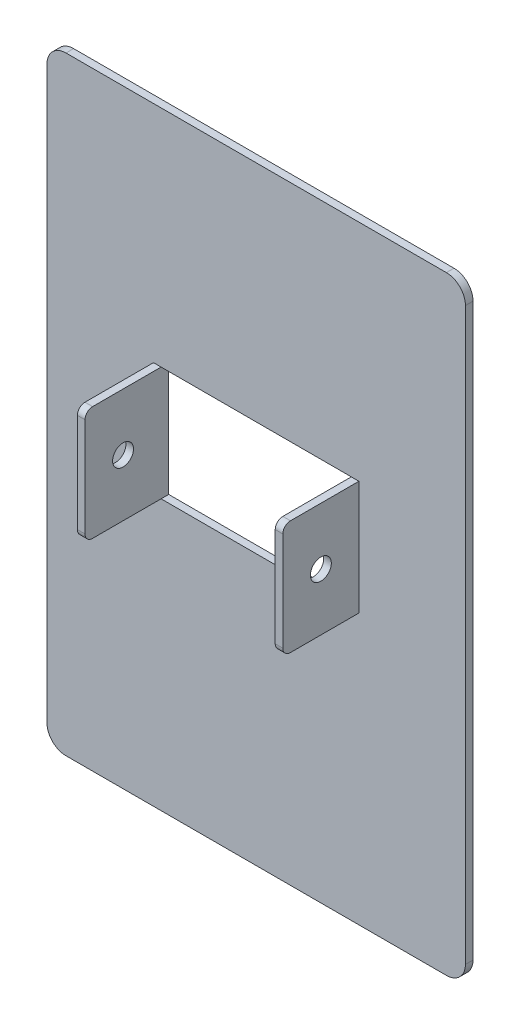
ISO-10303-21;
HEADER;
FILE_DESCRIPTION(('STEP AP214'),'2;1');
FILE_NAME('part.step','',(''),(''),'','','');
FILE_SCHEMA(('AUTOMOTIVE_DESIGN { 1 0 10303 214 1 1 1 1 }'));
ENDSEC;
DATA;
#1=APPLICATION_CONTEXT('core data for automotive mechanical design processes');
#2=APPLICATION_PROTOCOL_DEFINITION('international standard','automotive_design',2000,#1);
#3=PRODUCT_CONTEXT('',#1,'mechanical');
#4=PRODUCT('Part','Part','',(#3));
#5=PRODUCT_RELATED_PRODUCT_CATEGORY('part','',(#4));
#6=PRODUCT_DEFINITION_FORMATION('','',#4);
#7=PRODUCT_DEFINITION_CONTEXT('part definition',#1,'design');
#8=PRODUCT_DEFINITION('design','',#6,#7);
#9=PRODUCT_DEFINITION_SHAPE('','',#8);
#10=(LENGTH_UNIT() NAMED_UNIT(*) SI_UNIT(.MILLI.,.METRE.));
#11=(NAMED_UNIT(*) PLANE_ANGLE_UNIT() SI_UNIT($,.RADIAN.));
#12=(NAMED_UNIT(*) SI_UNIT($,.STERADIAN.) SOLID_ANGLE_UNIT());
#13=UNCERTAINTY_MEASURE_WITH_UNIT(LENGTH_MEASURE(1.E-05),#10,'distance_accuracy_value','');
#14=(GEOMETRIC_REPRESENTATION_CONTEXT(3) GLOBAL_UNCERTAINTY_ASSIGNED_CONTEXT((#13)) GLOBAL_UNIT_ASSIGNED_CONTEXT((#10,
#11,#12)) REPRESENTATION_CONTEXT('',''));
#15=CARTESIAN_POINT('',(0.,0.,0.));
#16=DIRECTION('',(0.,0.,1.));
#17=DIRECTION('',(1.,0.,0.));
#18=AXIS2_PLACEMENT_3D('',#15,#16,#17);
#19=CARTESIAN_POINT('',(27.,90.,22.));
#20=DIRECTION('',(-1.,0.,0.));
#21=DIRECTION('',(0.,0.,1.));
#22=AXIS2_PLACEMENT_3D('',#19,#20,#21);
#23=PLANE('',#22);
#24=CARTESIAN_POINT('',(27.,118.,20.));
#25=DIRECTION('',(-1.,0.,0.));
#26=DIRECTION('',(0.,0.,1.));
#27=AXIS2_PLACEMENT_3D('',#24,#25,#26);
#28=CIRCLE('',#27,2.);
#29=CARTESIAN_POINT('',(27.,118.,22.));
#30=VERTEX_POINT('',#29);
#31=CARTESIAN_POINT('',(27.,120.,20.));
#32=VERTEX_POINT('',#31);
#33=EDGE_CURVE('E170',#30,#32,#28,.T.);
#34=ORIENTED_EDGE('',*,*,#33,.F.);
#35=DIRECTION('',(0.,1.,0.));
#36=VECTOR('',#35,1.);
#37=CARTESIAN_POINT('',(27.,90.,22.));
#38=LINE('',#37,#36);
#39=CARTESIAN_POINT('',(27.,92.,22.));
#40=VERTEX_POINT('',#39);
#41=EDGE_CURVE('E146',#30,#40,#38,.F.);
#42=ORIENTED_EDGE('',*,*,#41,.T.);
#43=CARTESIAN_POINT('',(27.,92.,20.));
#44=DIRECTION('',(1.,0.,0.));
#45=DIRECTION('',(0.,0.,-1.));
#46=AXIS2_PLACEMENT_3D('',#43,#44,#45);
#47=CIRCLE('',#46,2.);
#48=CARTESIAN_POINT('',(27.,90.,20.));
#49=VERTEX_POINT('',#48);
#50=EDGE_CURVE('E139',#49,#40,#47,.F.);
#51=ORIENTED_EDGE('',*,*,#50,.F.);
#52=DIRECTION('',(0.,0.,1.));
#53=VECTOR('',#52,1.);
#54=CARTESIAN_POINT('',(27.,90.,22.));
#55=LINE('',#54,#53);
#56=CARTESIAN_POINT('',(27.,90.,2.));
#57=VERTEX_POINT('',#56);
#58=EDGE_CURVE('E143',#49,#57,#55,.F.);
#59=ORIENTED_EDGE('',*,*,#58,.T.);
#60=DIRECTION('',(0.,1.,0.));
#61=VECTOR('',#60,1.);
#62=CARTESIAN_POINT('',(27.,174.,2.));
#63=LINE('',#62,#61);
#64=CARTESIAN_POINT('',(27.,120.,2.));
#65=VERTEX_POINT('',#64);
#66=EDGE_CURVE('E173',#65,#57,#63,.F.);
#67=ORIENTED_EDGE('',*,*,#66,.F.);
#68=DIRECTION('',(0.,0.,-1.));
#69=VECTOR('',#68,1.);
#70=CARTESIAN_POINT('',(27.,120.,22.));
#71=LINE('',#70,#69);
#72=EDGE_CURVE('E158',#65,#32,#71,.F.);
#73=ORIENTED_EDGE('',*,*,#72,.T.);
#74=EDGE_LOOP('',(#34,#42,#51,#59,#67,#73));
#75=FACE_BOUND('',#74,.T.);
#76=CARTESIAN_POINT('',(27.,105.,12.));
#77=DIRECTION('',(-1.,0.,0.));
#78=DIRECTION('',(0.,0.,1.));
#79=AXIS2_PLACEMENT_3D('',#76,#77,#78);
#80=CIRCLE('',#79,2.75);
#81=CARTESIAN_POINT('',(27.,105.,14.75));
#82=VERTEX_POINT('',#81);
#83=EDGE_CURVE('E21',#82,#82,#80,.T.);
#84=ORIENTED_EDGE('',*,*,#83,.T.);
#85=EDGE_LOOP('',(#84));
#86=FACE_BOUND('',#85,.T.);
#87=ADVANCED_FACE('F18',(#75,#86),#23,.F.);
#88=CARTESIAN_POINT('',(-27.,120.,22.));
#89=DIRECTION('',(1.,0.,0.));
#90=DIRECTION('',(0.,0.,-1.));
#91=AXIS2_PLACEMENT_3D('',#88,#89,#90);
#92=PLANE('',#91);
#93=CARTESIAN_POINT('',(-27.,118.,20.));
#94=DIRECTION('',(-1.,0.,0.));
#95=DIRECTION('',(0.,0.,1.));
#96=AXIS2_PLACEMENT_3D('',#93,#94,#95);
#97=CIRCLE('',#96,2.);
#98=CARTESIAN_POINT('',(-27.,120.,20.));
#99=VERTEX_POINT('',#98);
#100=CARTESIAN_POINT('',(-27.,118.,22.));
#101=VERTEX_POINT('',#100);
#102=EDGE_CURVE('E203',#99,#101,#97,.F.);
#103=ORIENTED_EDGE('',*,*,#102,.F.);
#104=DIRECTION('',(0.,0.,-1.));
#105=VECTOR('',#104,1.);
#106=CARTESIAN_POINT('',(-27.,120.,22.));
#107=LINE('',#106,#105);
#108=CARTESIAN_POINT('',(-27.,120.,2.));
#109=VERTEX_POINT('',#108);
#110=EDGE_CURVE('E176',#99,#109,#107,.T.);
#111=ORIENTED_EDGE('',*,*,#110,.T.);
#112=DIRECTION('',(0.,1.,0.));
#113=VECTOR('',#112,1.);
#114=CARTESIAN_POINT('',(-27.,174.,2.));
#115=LINE('',#114,#113);
#116=CARTESIAN_POINT('',(-27.,90.,2.));
#117=VERTEX_POINT('',#116);
#118=EDGE_CURVE('E184',#117,#109,#115,.T.);
#119=ORIENTED_EDGE('',*,*,#118,.F.);
#120=DIRECTION('',(0.,0.,1.));
#121=VECTOR('',#120,1.);
#122=CARTESIAN_POINT('',(-27.,90.,22.));
#123=LINE('',#122,#121);
#124=CARTESIAN_POINT('',(-27.,90.,20.));
#125=VERTEX_POINT('',#124);
#126=EDGE_CURVE('E191',#117,#125,#123,.T.);
#127=ORIENTED_EDGE('',*,*,#126,.T.);
#128=CARTESIAN_POINT('',(-27.,92.,20.));
#129=DIRECTION('',(1.,0.,0.));
#130=DIRECTION('',(0.,0.,-1.));
#131=AXIS2_PLACEMENT_3D('',#128,#129,#130);
#132=CIRCLE('',#131,2.);
#133=CARTESIAN_POINT('',(-27.,92.,22.));
#134=VERTEX_POINT('',#133);
#135=EDGE_CURVE('E194',#134,#125,#132,.T.);
#136=ORIENTED_EDGE('',*,*,#135,.F.);
#137=DIRECTION('',(0.,1.,0.));
#138=VECTOR('',#137,1.);
#139=CARTESIAN_POINT('',(-27.,120.,22.));
#140=LINE('',#139,#138);
#141=EDGE_CURVE('E200',#134,#101,#140,.T.);
#142=ORIENTED_EDGE('',*,*,#141,.T.);
#143=EDGE_LOOP('',(#103,#111,#119,#127,#136,#142));
#144=FACE_BOUND('',#143,.T.);
#145=CARTESIAN_POINT('',(-27.,105.,12.));
#146=DIRECTION('',(-1.,0.,0.));
#147=DIRECTION('',(0.,0.,1.));
#148=AXIS2_PLACEMENT_3D('',#145,#146,#147);
#149=CIRCLE('',#148,2.75);
#150=CARTESIAN_POINT('',(-27.,105.,14.75));
#151=VERTEX_POINT('',#150);
#152=EDGE_CURVE('E195',#151,#151,#149,.F.);
#153=ORIENTED_EDGE('',*,*,#152,.T.);
#154=EDGE_LOOP('',(#153));
#155=FACE_BOUND('',#154,.T.);
#156=ADVANCED_FACE('F683',(#144,#155),#92,.F.);
#157=CARTESIAN_POINT('',(34.778174593052,105.,12.));
#158=DIRECTION('',(-1.,0.,0.));
#159=DIRECTION('',(0.,0.,1.));
#160=AXIS2_PLACEMENT_3D('',#157,#158,#159);
#161=CYLINDRICAL_SURFACE('',#160,2.75);
#162=CARTESIAN_POINT('',(25.,105.,12.));
#163=DIRECTION('',(-1.,0.,0.));
#164=DIRECTION('',(0.,0.,1.));
#165=AXIS2_PLACEMENT_3D('',#162,#163,#164);
#166=CIRCLE('',#165,2.75);
#167=CARTESIAN_POINT('',(25.,105.,14.75));
#168=VERTEX_POINT('',#167);
#169=EDGE_CURVE('E255',#168,#168,#166,.T.);
#170=ORIENTED_EDGE('',*,*,#169,.T.);
#171=EDGE_LOOP('',(#170));
#172=FACE_BOUND('',#171,.T.);
#173=ORIENTED_EDGE('',*,*,#83,.F.);
#174=EDGE_LOOP('',(#173));
#175=FACE_BOUND('',#174,.T.);
#176=ADVANCED_FACE('F675',(#172,#175),#161,.F.);
#177=CARTESIAN_POINT('',(25.,92.,20.));
#178=DIRECTION('',(1.,0.,0.));
#179=DIRECTION('',(0.,0.,-1.));
#180=AXIS2_PLACEMENT_3D('',#177,#178,#179);
#181=CYLINDRICAL_SURFACE('',#180,2.);
#182=ORIENTED_EDGE('',*,*,#50,.T.);
#183=DIRECTION('',(-1.,0.,0.));
#184=VECTOR('',#183,1.);
#185=CARTESIAN_POINT('',(25.,92.,22.));
#186=LINE('',#185,#184);
#187=CARTESIAN_POINT('',(25.,92.,22.));
#188=VERTEX_POINT('',#187);
#189=EDGE_CURVE('E268',#40,#188,#186,.T.);
#190=ORIENTED_EDGE('',*,*,#189,.T.);
#191=CARTESIAN_POINT('',(25.,92.,20.));
#192=DIRECTION('',(1.,0.,0.));
#193=DIRECTION('',(0.,0.,-1.));
#194=AXIS2_PLACEMENT_3D('',#191,#192,#193);
#195=CIRCLE('',#194,2.);
#196=CARTESIAN_POINT('',(25.,90.,20.));
#197=VERTEX_POINT('',#196);
#198=EDGE_CURVE('E162',#188,#197,#195,.T.);
#199=ORIENTED_EDGE('',*,*,#198,.T.);
#200=DIRECTION('',(1.,0.,0.));
#201=VECTOR('',#200,1.);
#202=CARTESIAN_POINT('',(27.,90.,20.));
#203=LINE('',#202,#201);
#204=EDGE_CURVE('E151',#197,#49,#203,.T.);
#205=ORIENTED_EDGE('',*,*,#204,.T.);
#206=EDGE_LOOP('',(#182,#190,#199,#205));
#207=FACE_BOUND('',#206,.T.);
#208=ADVANCED_FACE('F161',(#207),#181,.T.);
#209=CARTESIAN_POINT('',(27.,90.,22.));
#210=DIRECTION('',(0.,1.,0.));
#211=DIRECTION('',(0.,0.,1.));
#212=AXIS2_PLACEMENT_3D('',#209,#210,#211);
#213=PLANE('',#212);
#214=ORIENTED_EDGE('',*,*,#204,.F.);
#215=DIRECTION('',(0.,0.,-1.));
#216=VECTOR('',#215,1.);
#217=CARTESIAN_POINT('',(25.,90.,-58.309518948453));
#218=LINE('',#217,#216);
#219=CARTESIAN_POINT('',(25.,90.,2.));
#220=VERTEX_POINT('',#219);
#221=EDGE_CURVE('E254',#197,#220,#218,.T.);
#222=ORIENTED_EDGE('',*,*,#221,.T.);
#223=DIRECTION('',(1.,0.,0.));
#224=VECTOR('',#223,1.);
#225=CARTESIAN_POINT('',(50.,90.,2.));
#226=LINE('',#225,#224);
#227=EDGE_CURVE('E157',#57,#220,#226,.F.);
#228=ORIENTED_EDGE('',*,*,#227,.F.);
#229=ORIENTED_EDGE('',*,*,#58,.F.);
#230=EDGE_LOOP('',(#214,#222,#228,#229));
#231=FACE_BOUND('',#230,.T.);
#232=ADVANCED_FACE('F153',(#231),#213,.F.);
#233=CARTESIAN_POINT('',(27.,120.,22.));
#234=DIRECTION('',(0.,-1.,0.));
#235=DIRECTION('',(0.,0.,-1.));
#236=AXIS2_PLACEMENT_3D('',#233,#234,#235);
#237=PLANE('',#236);
#238=DIRECTION('',(-1.,0.,0.));
#239=VECTOR('',#238,1.);
#240=CARTESIAN_POINT('',(25.,120.,20.));
#241=LINE('',#240,#239);
#242=CARTESIAN_POINT('',(25.,120.,20.));
#243=VERTEX_POINT('',#242);
#244=EDGE_CURVE('E265',#32,#243,#241,.T.);
#245=ORIENTED_EDGE('',*,*,#244,.F.);
#246=ORIENTED_EDGE('',*,*,#72,.F.);
#247=DIRECTION('',(1.,0.,0.));
#248=VECTOR('',#247,1.);
#249=CARTESIAN_POINT('',(50.,120.,2.));
#250=LINE('',#249,#248);
#251=CARTESIAN_POINT('',(25.,120.,2.));
#252=VERTEX_POINT('',#251);
#253=EDGE_CURVE('E258',#252,#65,#250,.T.);
#254=ORIENTED_EDGE('',*,*,#253,.F.);
#255=DIRECTION('',(0.,0.,-1.));
#256=VECTOR('',#255,1.);
#257=CARTESIAN_POINT('',(25.,120.,-58.309518948453));
#258=LINE('',#257,#256);
#259=EDGE_CURVE('E252',#252,#243,#258,.F.);
#260=ORIENTED_EDGE('',*,*,#259,.T.);
#261=EDGE_LOOP('',(#245,#246,#254,#260));
#262=FACE_BOUND('',#261,.T.);
#263=ADVANCED_FACE('F424',(#262),#237,.F.);
#264=CARTESIAN_POINT('',(25.,118.,20.));
#265=DIRECTION('',(-1.,0.,0.));
#266=DIRECTION('',(0.,0.,1.));
#267=AXIS2_PLACEMENT_3D('',#264,#265,#266);
#268=CYLINDRICAL_SURFACE('',#267,2.);
#269=CARTESIAN_POINT('',(25.,118.,20.));
#270=DIRECTION('',(-1.,0.,0.));
#271=DIRECTION('',(0.,0.,1.));
#272=AXIS2_PLACEMENT_3D('',#269,#270,#271);
#273=CIRCLE('',#272,2.);
#274=CARTESIAN_POINT('',(25.,118.,22.));
#275=VERTEX_POINT('',#274);
#276=EDGE_CURVE('E248',#243,#275,#273,.F.);
#277=ORIENTED_EDGE('',*,*,#276,.T.);
#278=DIRECTION('',(-1.,0.,0.));
#279=VECTOR('',#278,1.);
#280=CARTESIAN_POINT('',(25.,118.,22.));
#281=LINE('',#280,#279);
#282=EDGE_CURVE('E205',#275,#30,#281,.F.);
#283=ORIENTED_EDGE('',*,*,#282,.T.);
#284=ORIENTED_EDGE('',*,*,#33,.T.);
#285=ORIENTED_EDGE('',*,*,#244,.T.);
#286=EDGE_LOOP('',(#277,#283,#284,#285));
#287=FACE_BOUND('',#286,.T.);
#288=ADVANCED_FACE('F344',(#287),#268,.T.);
#289=CARTESIAN_POINT('',(25.,90.,22.));
#290=DIRECTION('',(0.,0.,-1.));
#291=DIRECTION('',(-1.,0.,0.));
#292=AXIS2_PLACEMENT_3D('',#289,#290,#291);
#293=PLANE('',#292);
#294=ORIENTED_EDGE('',*,*,#282,.F.);
#295=DIRECTION('',(0.,1.,0.));
#296=VECTOR('',#295,1.);
#297=CARTESIAN_POINT('',(25.,120.,22.));
#298=LINE('',#297,#296);
#299=EDGE_CURVE('E251',#275,#188,#298,.F.);
#300=ORIENTED_EDGE('',*,*,#299,.T.);
#301=ORIENTED_EDGE('',*,*,#189,.F.);
#302=ORIENTED_EDGE('',*,*,#41,.F.);
#303=EDGE_LOOP('',(#294,#300,#301,#302));
#304=FACE_BOUND('',#303,.T.);
#305=ADVANCED_FACE('F348',(#304),#293,.F.);
#306=CARTESIAN_POINT('',(34.778174593052,105.,12.));
#307=DIRECTION('',(-1.,0.,0.));
#308=DIRECTION('',(0.,0.,1.));
#309=AXIS2_PLACEMENT_3D('',#306,#307,#308);
#310=CYLINDRICAL_SURFACE('',#309,2.75);
#311=CARTESIAN_POINT('',(-25.,105.,12.));
#312=DIRECTION('',(-1.,0.,0.));
#313=DIRECTION('',(0.,0.,1.));
#314=AXIS2_PLACEMENT_3D('',#311,#312,#313);
#315=CIRCLE('',#314,2.75);
#316=CARTESIAN_POINT('',(-25.,105.,14.75));
#317=VERTEX_POINT('',#316);
#318=EDGE_CURVE('E243',#317,#317,#315,.F.);
#319=ORIENTED_EDGE('',*,*,#318,.T.);
#320=EDGE_LOOP('',(#319));
#321=FACE_BOUND('',#320,.T.);
#322=ORIENTED_EDGE('',*,*,#152,.F.);
#323=EDGE_LOOP('',(#322));
#324=FACE_BOUND('',#323,.T.);
#325=ADVANCED_FACE('F631',(#321,#324),#310,.F.);
#326=CARTESIAN_POINT('',(-27.,90.,22.));
#327=DIRECTION('',(0.,1.,0.));
#328=DIRECTION('',(0.,0.,1.));
#329=AXIS2_PLACEMENT_3D('',#326,#327,#328);
#330=PLANE('',#329);
#331=DIRECTION('',(1.,0.,0.));
#332=VECTOR('',#331,1.);
#333=CARTESIAN_POINT('',(-25.,90.,20.));
#334=LINE('',#333,#332);
#335=CARTESIAN_POINT('',(-25.,90.,20.));
#336=VERTEX_POINT('',#335);
#337=EDGE_CURVE('E262',#125,#336,#334,.T.);
#338=ORIENTED_EDGE('',*,*,#337,.F.);
#339=ORIENTED_EDGE('',*,*,#126,.F.);
#340=DIRECTION('',(1.,0.,0.));
#341=VECTOR('',#340,1.);
#342=CARTESIAN_POINT('',(50.,90.,2.));
#343=LINE('',#342,#341);
#344=CARTESIAN_POINT('',(-25.,90.,2.));
#345=VERTEX_POINT('',#344);
#346=EDGE_CURVE('E188',#345,#117,#343,.F.);
#347=ORIENTED_EDGE('',*,*,#346,.F.);
#348=DIRECTION('',(0.,0.,1.));
#349=VECTOR('',#348,1.);
#350=CARTESIAN_POINT('',(-25.,90.,-58.309518948453));
#351=LINE('',#350,#349);
#352=EDGE_CURVE('E242',#345,#336,#351,.T.);
#353=ORIENTED_EDGE('',*,*,#352,.T.);
#354=EDGE_LOOP('',(#338,#339,#347,#353));
#355=FACE_BOUND('',#354,.T.);
#356=ADVANCED_FACE('F391',(#355),#330,.F.);
#357=CARTESIAN_POINT('',(-25.,92.,20.));
#358=DIRECTION('',(1.,0.,0.));
#359=DIRECTION('',(0.,0.,-1.));
#360=AXIS2_PLACEMENT_3D('',#357,#358,#359);
#361=CYLINDRICAL_SURFACE('',#360,2.);
#362=CARTESIAN_POINT('',(-25.,92.,20.));
#363=DIRECTION('',(1.,0.,0.));
#364=DIRECTION('',(0.,0.,-1.));
#365=AXIS2_PLACEMENT_3D('',#362,#363,#364);
#366=CIRCLE('',#365,2.);
#367=CARTESIAN_POINT('',(-25.,92.,22.));
#368=VERTEX_POINT('',#367);
#369=EDGE_CURVE('E239',#336,#368,#366,.F.);
#370=ORIENTED_EDGE('',*,*,#369,.T.);
#371=DIRECTION('',(-1.,0.,0.));
#372=VECTOR('',#371,1.);
#373=CARTESIAN_POINT('',(-25.,92.,22.));
#374=LINE('',#373,#372);
#375=EDGE_CURVE('E204',#368,#134,#374,.T.);
#376=ORIENTED_EDGE('',*,*,#375,.T.);
#377=ORIENTED_EDGE('',*,*,#135,.T.);
#378=ORIENTED_EDGE('',*,*,#337,.T.);
#379=EDGE_LOOP('',(#370,#376,#377,#378));
#380=FACE_BOUND('',#379,.T.);
#381=ADVANCED_FACE('F614',(#380),#361,.T.);
#382=CARTESIAN_POINT('',(-25.,120.,22.));
#383=DIRECTION('',(0.,0.,-1.));
#384=DIRECTION('',(-1.,0.,0.));
#385=AXIS2_PLACEMENT_3D('',#382,#383,#384);
#386=PLANE('',#385);
#387=DIRECTION('',(-1.,0.,0.));
#388=VECTOR('',#387,1.);
#389=CARTESIAN_POINT('',(-25.,118.,22.));
#390=LINE('',#389,#388);
#391=CARTESIAN_POINT('',(-25.,118.,22.));
#392=VERTEX_POINT('',#391);
#393=EDGE_CURVE('E260',#101,#392,#390,.F.);
#394=ORIENTED_EDGE('',*,*,#393,.F.);
#395=ORIENTED_EDGE('',*,*,#141,.F.);
#396=ORIENTED_EDGE('',*,*,#375,.F.);
#397=DIRECTION('',(0.,1.,0.));
#398=VECTOR('',#397,1.);
#399=CARTESIAN_POINT('',(-25.,120.,22.));
#400=LINE('',#399,#398);
#401=EDGE_CURVE('E238',#368,#392,#400,.T.);
#402=ORIENTED_EDGE('',*,*,#401,.T.);
#403=EDGE_LOOP('',(#394,#395,#396,#402));
#404=FACE_BOUND('',#403,.T.);
#405=ADVANCED_FACE('F605',(#404),#386,.F.);
#406=CARTESIAN_POINT('',(-25.,118.,20.));
#407=DIRECTION('',(-1.,0.,0.));
#408=DIRECTION('',(0.,0.,1.));
#409=AXIS2_PLACEMENT_3D('',#406,#407,#408);
#410=CYLINDRICAL_SURFACE('',#409,2.);
#411=ORIENTED_EDGE('',*,*,#102,.T.);
#412=ORIENTED_EDGE('',*,*,#393,.T.);
#413=CARTESIAN_POINT('',(-25.,118.,20.));
#414=DIRECTION('',(-1.,0.,0.));
#415=DIRECTION('',(0.,0.,1.));
#416=AXIS2_PLACEMENT_3D('',#413,#414,#415);
#417=CIRCLE('',#416,2.);
#418=CARTESIAN_POINT('',(-25.,120.,20.));
#419=VERTEX_POINT('',#418);
#420=EDGE_CURVE('E234',#392,#419,#417,.T.);
#421=ORIENTED_EDGE('',*,*,#420,.T.);
#422=DIRECTION('',(1.,0.,0.));
#423=VECTOR('',#422,1.);
#424=CARTESIAN_POINT('',(-27.,120.,20.));
#425=LINE('',#424,#423);
#426=EDGE_CURVE('E181',#419,#99,#425,.F.);
#427=ORIENTED_EDGE('',*,*,#426,.T.);
#428=EDGE_LOOP('',(#411,#412,#421,#427));
#429=FACE_BOUND('',#428,.T.);
#430=ADVANCED_FACE('F596',(#429),#410,.T.);
#431=CARTESIAN_POINT('',(-27.,120.,22.));
#432=DIRECTION('',(0.,-1.,0.));
#433=DIRECTION('',(0.,0.,-1.));
#434=AXIS2_PLACEMENT_3D('',#431,#432,#433);
#435=PLANE('',#434);
#436=ORIENTED_EDGE('',*,*,#426,.F.);
#437=DIRECTION('',(0.,0.,1.));
#438=VECTOR('',#437,1.);
#439=CARTESIAN_POINT('',(-25.,120.,-58.309518948453));
#440=LINE('',#439,#438);
#441=CARTESIAN_POINT('',(-25.,120.,2.));
#442=VERTEX_POINT('',#441);
#443=EDGE_CURVE('E237',#419,#442,#440,.F.);
#444=ORIENTED_EDGE('',*,*,#443,.T.);
#445=DIRECTION('',(1.,0.,0.));
#446=VECTOR('',#445,1.);
#447=CARTESIAN_POINT('',(50.,120.,2.));
#448=LINE('',#447,#446);
#449=EDGE_CURVE('E187',#109,#442,#448,.T.);
#450=ORIENTED_EDGE('',*,*,#449,.F.);
#451=ORIENTED_EDGE('',*,*,#110,.F.);
#452=EDGE_LOOP('',(#436,#444,#450,#451));
#453=FACE_BOUND('',#452,.T.);
#454=ADVANCED_FACE('F588',(#453),#435,.F.);
#455=CARTESIAN_POINT('',(50.,174.,2.));
#456=DIRECTION('',(0.,0.,1.));
#457=DIRECTION('',(1.,0.,0.));
#458=AXIS2_PLACEMENT_3D('',#455,#456,#457);
#459=PLANE('',#458);
#460=DIRECTION('',(1.,0.,0.));
#461=VECTOR('',#460,1.);
#462=CARTESIAN_POINT('',(-25.,120.,2.));
#463=LINE('',#462,#461);
#464=EDGE_CURVE('E280',#442,#252,#463,.T.);
#465=ORIENTED_EDGE('',*,*,#464,.T.);
#466=ORIENTED_EDGE('',*,*,#253,.T.);
#467=ORIENTED_EDGE('',*,*,#66,.T.);
#468=ORIENTED_EDGE('',*,*,#227,.T.);
#469=DIRECTION('',(1.,0.,0.));
#470=VECTOR('',#469,1.);
#471=CARTESIAN_POINT('',(-25.,90.,2.));
#472=LINE('',#471,#470);
#473=EDGE_CURVE('E247',#220,#345,#472,.F.);
#474=ORIENTED_EDGE('',*,*,#473,.T.);
#475=ORIENTED_EDGE('',*,*,#346,.T.);
#476=ORIENTED_EDGE('',*,*,#118,.T.);
#477=ORIENTED_EDGE('',*,*,#449,.T.);
#478=EDGE_LOOP('',(#465,#466,#467,#468,#474,#475,#476,#477));
#479=FACE_BOUND('',#478,.T.);
#480=CARTESIAN_POINT('',(50.,24.,2.));
#481=DIRECTION('',(0.,0.,-1.));
#482=DIRECTION('',(-1.,0.,0.));
#483=AXIS2_PLACEMENT_3D('',#480,#481,#482);
#484=CIRCLE('',#483,5.);
#485=CARTESIAN_POINT('',(55.,24.,2.));
#486=VERTEX_POINT('',#485);
#487=CARTESIAN_POINT('',(50.,19.,2.));
#488=VERTEX_POINT('',#487);
#489=EDGE_CURVE('E222',#486,#488,#484,.T.);
#490=ORIENTED_EDGE('',*,*,#489,.F.);
#491=DIRECTION('',(0.,-1.,0.));
#492=VECTOR('',#491,1.);
#493=CARTESIAN_POINT('',(55.,174.,2.));
#494=LINE('',#493,#492);
#495=CARTESIAN_POINT('',(55.,174.,2.));
#496=VERTEX_POINT('',#495);
#497=EDGE_CURVE('E363',#486,#496,#494,.F.);
#498=ORIENTED_EDGE('',*,*,#497,.T.);
#499=CARTESIAN_POINT('',(50.,174.,2.));
#500=DIRECTION('',(0.,0.,-1.));
#501=DIRECTION('',(-1.,0.,0.));
#502=AXIS2_PLACEMENT_3D('',#499,#500,#501);
#503=CIRCLE('',#502,5.);
#504=CARTESIAN_POINT('',(50.,179.,2.));
#505=VERTEX_POINT('',#504);
#506=EDGE_CURVE('E219',#505,#496,#503,.T.);
#507=ORIENTED_EDGE('',*,*,#506,.F.);
#508=DIRECTION('',(1.,0.,0.));
#509=VECTOR('',#508,1.);
#510=CARTESIAN_POINT('',(50.,179.,2.));
#511=LINE('',#510,#509);
#512=CARTESIAN_POINT('',(-50.,179.,2.));
#513=VERTEX_POINT('',#512);
#514=EDGE_CURVE('E233',#505,#513,#511,.F.);
#515=ORIENTED_EDGE('',*,*,#514,.T.);
#516=CARTESIAN_POINT('',(-50.,174.,2.));
#517=DIRECTION('',(0.,0.,-1.));
#518=DIRECTION('',(-1.,0.,0.));
#519=AXIS2_PLACEMENT_3D('',#516,#517,#518);
#520=CIRCLE('',#519,5.);
#521=CARTESIAN_POINT('',(-55.,174.,2.));
#522=VERTEX_POINT('',#521);
#523=EDGE_CURVE('E230',#522,#513,#520,.T.);
#524=ORIENTED_EDGE('',*,*,#523,.F.);
#525=DIRECTION('',(0.,1.,0.));
#526=VECTOR('',#525,1.);
#527=CARTESIAN_POINT('',(-55.,174.,2.));
#528=LINE('',#527,#526);
#529=CARTESIAN_POINT('',(-55.,24.,2.));
#530=VERTEX_POINT('',#529);
#531=EDGE_CURVE('E229',#522,#530,#528,.F.);
#532=ORIENTED_EDGE('',*,*,#531,.T.);
#533=CARTESIAN_POINT('',(-50.,24.,2.));
#534=DIRECTION('',(0.,0.,-1.));
#535=DIRECTION('',(-1.,0.,0.));
#536=AXIS2_PLACEMENT_3D('',#533,#534,#535);
#537=CIRCLE('',#536,5.);
#538=CARTESIAN_POINT('',(-50.,19.,2.));
#539=VERTEX_POINT('',#538);
#540=EDGE_CURVE('E226',#539,#530,#537,.T.);
#541=ORIENTED_EDGE('',*,*,#540,.F.);
#542=DIRECTION('',(1.,0.,0.));
#543=VECTOR('',#542,1.);
#544=CARTESIAN_POINT('',(50.,19.,2.));
#545=LINE('',#544,#543);
#546=EDGE_CURVE('E225',#539,#488,#545,.T.);
#547=ORIENTED_EDGE('',*,*,#546,.T.);
#548=EDGE_LOOP('',(#490,#498,#507,#515,#524,#532,#541,#547));
#549=FACE_BOUND('',#548,.T.);
#550=ADVANCED_FACE('F423',(#479,#549),#459,.T.);
#551=CARTESIAN_POINT('',(25.,120.,-58.309518948453));
#552=DIRECTION('',(1.,0.,0.));
#553=DIRECTION('',(0.,0.,-1.));
#554=AXIS2_PLACEMENT_3D('',#551,#552,#553);
#555=PLANE('',#554);
#556=ORIENTED_EDGE('',*,*,#276,.F.);
#557=ORIENTED_EDGE('',*,*,#259,.F.);
#558=DIRECTION('',(0.,0.,1.));
#559=VECTOR('',#558,1.);
#560=CARTESIAN_POINT('',(25.,120.,-58.309518948453));
#561=LINE('',#560,#559);
#562=CARTESIAN_POINT('',(25.,120.,0.));
#563=VERTEX_POINT('',#562);
#564=EDGE_CURVE('E278',#252,#563,#561,.F.);
#565=ORIENTED_EDGE('',*,*,#564,.T.);
#566=DIRECTION('',(0.,1.,0.));
#567=VECTOR('',#566,1.);
#568=CARTESIAN_POINT('',(25.,174.,0.));
#569=LINE('',#568,#567);
#570=CARTESIAN_POINT('',(25.,90.,0.));
#571=VERTEX_POINT('',#570);
#572=EDGE_CURVE('E328',#563,#571,#569,.F.);
#573=ORIENTED_EDGE('',*,*,#572,.T.);
#574=DIRECTION('',(0.,0.,-1.));
#575=VECTOR('',#574,1.);
#576=CARTESIAN_POINT('',(25.,90.,-58.309518948453));
#577=LINE('',#576,#575);
#578=EDGE_CURVE('E316',#571,#220,#577,.F.);
#579=ORIENTED_EDGE('',*,*,#578,.T.);
#580=ORIENTED_EDGE('',*,*,#221,.F.);
#581=ORIENTED_EDGE('',*,*,#198,.F.);
#582=ORIENTED_EDGE('',*,*,#299,.F.);
#583=EDGE_LOOP('',(#556,#557,#565,#573,#579,#580,#581,#582));
#584=FACE_BOUND('',#583,.T.);
#585=ORIENTED_EDGE('',*,*,#169,.F.);
#586=EDGE_LOOP('',(#585));
#587=FACE_BOUND('',#586,.T.);
#588=ADVANCED_FACE('F349',(#584,#587),#555,.F.);
#589=CARTESIAN_POINT('',(-25.,90.,-58.309518948453));
#590=DIRECTION('',(0.,-1.,0.));
#591=DIRECTION('',(0.,0.,-1.));
#592=AXIS2_PLACEMENT_3D('',#589,#590,#591);
#593=PLANE('',#592);
#594=DIRECTION('',(0.,0.,1.));
#595=VECTOR('',#594,1.);
#596=CARTESIAN_POINT('',(-25.,90.,-58.309518948453));
#597=LINE('',#596,#595);
#598=CARTESIAN_POINT('',(-25.,90.,0.));
#599=VERTEX_POINT('',#598);
#600=EDGE_CURVE('E246',#599,#345,#597,.T.);
#601=ORIENTED_EDGE('',*,*,#600,.T.);
#602=ORIENTED_EDGE('',*,*,#473,.F.);
#603=ORIENTED_EDGE('',*,*,#578,.F.);
#604=DIRECTION('',(1.,0.,0.));
#605=VECTOR('',#604,1.);
#606=CARTESIAN_POINT('',(50.,90.,0.));
#607=LINE('',#606,#605);
#608=EDGE_CURVE('E323',#571,#599,#607,.F.);
#609=ORIENTED_EDGE('',*,*,#608,.T.);
#610=EDGE_LOOP('',(#601,#602,#603,#609));
#611=FACE_BOUND('',#610,.T.);
#612=ADVANCED_FACE('F405',(#611),#593,.F.);
#613=CARTESIAN_POINT('',(-25.,120.,-58.309518948453));
#614=DIRECTION('',(-1.,0.,0.));
#615=DIRECTION('',(0.,0.,1.));
#616=AXIS2_PLACEMENT_3D('',#613,#614,#615);
#617=PLANE('',#616);
#618=ORIENTED_EDGE('',*,*,#420,.F.);
#619=ORIENTED_EDGE('',*,*,#401,.F.);
#620=ORIENTED_EDGE('',*,*,#369,.F.);
#621=ORIENTED_EDGE('',*,*,#352,.F.);
#622=ORIENTED_EDGE('',*,*,#600,.F.);
#623=DIRECTION('',(0.,1.,0.));
#624=VECTOR('',#623,1.);
#625=CARTESIAN_POINT('',(-25.,174.,0.));
#626=LINE('',#625,#624);
#627=CARTESIAN_POINT('',(-25.,120.,0.));
#628=VERTEX_POINT('',#627);
#629=EDGE_CURVE('E319',#599,#628,#626,.T.);
#630=ORIENTED_EDGE('',*,*,#629,.T.);
#631=DIRECTION('',(0.,0.,1.));
#632=VECTOR('',#631,1.);
#633=CARTESIAN_POINT('',(-25.,120.,-58.309518948453));
#634=LINE('',#633,#632);
#635=EDGE_CURVE('E289',#628,#442,#634,.T.);
#636=ORIENTED_EDGE('',*,*,#635,.T.);
#637=ORIENTED_EDGE('',*,*,#443,.F.);
#638=EDGE_LOOP('',(#618,#619,#620,#621,#622,#630,#636,#637));
#639=FACE_BOUND('',#638,.T.);
#640=ORIENTED_EDGE('',*,*,#318,.F.);
#641=EDGE_LOOP('',(#640));
#642=FACE_BOUND('',#641,.T.);
#643=ADVANCED_FACE('F397',(#639,#642),#617,.F.);
#644=CARTESIAN_POINT('',(-25.,120.,-58.309518948453));
#645=DIRECTION('',(0.,1.,0.));
#646=DIRECTION('',(0.,0.,1.));
#647=AXIS2_PLACEMENT_3D('',#644,#645,#646);
#648=PLANE('',#647);
#649=ORIENTED_EDGE('',*,*,#564,.F.);
#650=ORIENTED_EDGE('',*,*,#464,.F.);
#651=ORIENTED_EDGE('',*,*,#635,.F.);
#652=DIRECTION('',(1.,0.,0.));
#653=VECTOR('',#652,1.);
#654=CARTESIAN_POINT('',(50.,120.,0.));
#655=LINE('',#654,#653);
#656=EDGE_CURVE('E322',#628,#563,#655,.T.);
#657=ORIENTED_EDGE('',*,*,#656,.T.);
#658=EDGE_LOOP('',(#649,#650,#651,#657));
#659=FACE_BOUND('',#658,.T.);
#660=ADVANCED_FACE('F430',(#659),#648,.F.);
#661=CARTESIAN_POINT('',(50.,179.,2.));
#662=DIRECTION('',(0.,-1.,0.));
#663=DIRECTION('',(0.,0.,-1.));
#664=AXIS2_PLACEMENT_3D('',#661,#662,#663);
#665=PLANE('',#664);
#666=DIRECTION('',(0.,0.,-1.));
#667=VECTOR('',#666,1.);
#668=CARTESIAN_POINT('',(-50.,179.,2.));
#669=LINE('',#668,#667);
#670=CARTESIAN_POINT('',(-50.,179.,0.));
#671=VERTEX_POINT('',#670);
#672=EDGE_CURVE('E232',#513,#671,#669,.T.);
#673=ORIENTED_EDGE('',*,*,#672,.F.);
#674=ORIENTED_EDGE('',*,*,#514,.F.);
#675=DIRECTION('',(0.,0.,-1.));
#676=VECTOR('',#675,1.);
#677=CARTESIAN_POINT('',(50.,179.,2.));
#678=LINE('',#677,#676);
#679=CARTESIAN_POINT('',(50.,179.,0.));
#680=VERTEX_POINT('',#679);
#681=EDGE_CURVE('E221',#680,#505,#678,.F.);
#682=ORIENTED_EDGE('',*,*,#681,.F.);
#683=DIRECTION('',(1.,0.,0.));
#684=VECTOR('',#683,1.);
#685=CARTESIAN_POINT('',(50.,179.,0.));
#686=LINE('',#685,#684);
#687=EDGE_CURVE('E218',#680,#671,#686,.F.);
#688=ORIENTED_EDGE('',*,*,#687,.T.);
#689=EDGE_LOOP('',(#673,#674,#682,#688));
#690=FACE_BOUND('',#689,.T.);
#691=ADVANCED_FACE('F473',(#690),#665,.F.);
#692=CARTESIAN_POINT('',(-50.,174.,2.));
#693=DIRECTION('',(0.,0.,-1.));
#694=DIRECTION('',(-1.,0.,0.));
#695=AXIS2_PLACEMENT_3D('',#692,#693,#694);
#696=CYLINDRICAL_SURFACE('',#695,5.);
#697=ORIENTED_EDGE('',*,*,#523,.T.);
#698=ORIENTED_EDGE('',*,*,#672,.T.);
#699=CARTESIAN_POINT('',(-50.,174.,0.));
#700=DIRECTION('',(0.,0.,-1.));
#701=DIRECTION('',(-1.,0.,0.));
#702=AXIS2_PLACEMENT_3D('',#699,#700,#701);
#703=CIRCLE('',#702,5.);
#704=CARTESIAN_POINT('',(-55.,174.,0.));
#705=VERTEX_POINT('',#704);
#706=EDGE_CURVE('E215',#671,#705,#703,.F.);
#707=ORIENTED_EDGE('',*,*,#706,.T.);
#708=DIRECTION('',(0.,0.,1.));
#709=VECTOR('',#708,1.);
#710=CARTESIAN_POINT('',(-55.,174.,2.));
#711=LINE('',#710,#709);
#712=EDGE_CURVE('E370',#705,#522,#711,.T.);
#713=ORIENTED_EDGE('',*,*,#712,.T.);
#714=EDGE_LOOP('',(#697,#698,#707,#713));
#715=FACE_BOUND('',#714,.T.);
#716=ADVANCED_FACE('F474',(#715),#696,.T.);
#717=CARTESIAN_POINT('',(-55.,174.,2.));
#718=DIRECTION('',(1.,0.,0.));
#719=DIRECTION('',(0.,1.,0.));
#720=AXIS2_PLACEMENT_3D('',#717,#718,#719);
#721=PLANE('',#720);
#722=DIRECTION('',(0.,0.,-1.));
#723=VECTOR('',#722,1.);
#724=CARTESIAN_POINT('',(-55.,24.,2.));
#725=LINE('',#724,#723);
#726=CARTESIAN_POINT('',(-55.,24.,0.));
#727=VERTEX_POINT('',#726);
#728=EDGE_CURVE('E228',#530,#727,#725,.T.);
#729=ORIENTED_EDGE('',*,*,#728,.F.);
#730=ORIENTED_EDGE('',*,*,#531,.F.);
#731=ORIENTED_EDGE('',*,*,#712,.F.);
#732=DIRECTION('',(0.,1.,0.));
#733=VECTOR('',#732,1.);
#734=CARTESIAN_POINT('',(-55.,174.,0.));
#735=LINE('',#734,#733);
#736=EDGE_CURVE('E214',#705,#727,#735,.F.);
#737=ORIENTED_EDGE('',*,*,#736,.T.);
#738=EDGE_LOOP('',(#729,#730,#731,#737));
#739=FACE_BOUND('',#738,.T.);
#740=ADVANCED_FACE('F455',(#739),#721,.F.);
#741=CARTESIAN_POINT('',(-50.,24.,2.));
#742=DIRECTION('',(0.,0.,-1.));
#743=DIRECTION('',(-1.,0.,0.));
#744=AXIS2_PLACEMENT_3D('',#741,#742,#743);
#745=CYLINDRICAL_SURFACE('',#744,5.);
#746=ORIENTED_EDGE('',*,*,#540,.T.);
#747=ORIENTED_EDGE('',*,*,#728,.T.);
#748=CARTESIAN_POINT('',(-50.,24.,0.));
#749=DIRECTION('',(0.,0.,-1.));
#750=DIRECTION('',(-1.,0.,0.));
#751=AXIS2_PLACEMENT_3D('',#748,#749,#750);
#752=CIRCLE('',#751,5.);
#753=CARTESIAN_POINT('',(-50.,19.,0.));
#754=VERTEX_POINT('',#753);
#755=EDGE_CURVE('E211',#727,#754,#752,.F.);
#756=ORIENTED_EDGE('',*,*,#755,.T.);
#757=DIRECTION('',(0.,0.,1.));
#758=VECTOR('',#757,1.);
#759=CARTESIAN_POINT('',(-50.,19.,2.));
#760=LINE('',#759,#758);
#761=EDGE_CURVE('E368',#754,#539,#760,.T.);
#762=ORIENTED_EDGE('',*,*,#761,.T.);
#763=EDGE_LOOP('',(#746,#747,#756,#762));
#764=FACE_BOUND('',#763,.T.);
#765=ADVANCED_FACE('F445',(#764),#745,.T.);
#766=CARTESIAN_POINT('',(50.,19.,2.));
#767=DIRECTION('',(0.,1.,0.));
#768=DIRECTION('',(0.,0.,1.));
#769=AXIS2_PLACEMENT_3D('',#766,#767,#768);
#770=PLANE('',#769);
#771=DIRECTION('',(0.,0.,-1.));
#772=VECTOR('',#771,1.);
#773=CARTESIAN_POINT('',(50.,19.,2.));
#774=LINE('',#773,#772);
#775=CARTESIAN_POINT('',(50.,19.,0.));
#776=VERTEX_POINT('',#775);
#777=EDGE_CURVE('E224',#488,#776,#774,.T.);
#778=ORIENTED_EDGE('',*,*,#777,.F.);
#779=ORIENTED_EDGE('',*,*,#546,.F.);
#780=ORIENTED_EDGE('',*,*,#761,.F.);
#781=DIRECTION('',(1.,0.,0.));
#782=VECTOR('',#781,1.);
#783=CARTESIAN_POINT('',(50.,19.,0.));
#784=LINE('',#783,#782);
#785=EDGE_CURVE('E210',#754,#776,#784,.T.);
#786=ORIENTED_EDGE('',*,*,#785,.T.);
#787=EDGE_LOOP('',(#778,#779,#780,#786));
#788=FACE_BOUND('',#787,.T.);
#789=ADVANCED_FACE('F467',(#788),#770,.F.);
#790=CARTESIAN_POINT('',(50.,24.,2.));
#791=DIRECTION('',(0.,0.,-1.));
#792=DIRECTION('',(-1.,0.,0.));
#793=AXIS2_PLACEMENT_3D('',#790,#791,#792);
#794=CYLINDRICAL_SURFACE('',#793,5.);
#795=ORIENTED_EDGE('',*,*,#489,.T.);
#796=ORIENTED_EDGE('',*,*,#777,.T.);
#797=CARTESIAN_POINT('',(50.,24.,0.));
#798=DIRECTION('',(0.,0.,-1.));
#799=DIRECTION('',(-1.,0.,0.));
#800=AXIS2_PLACEMENT_3D('',#797,#798,#799);
#801=CIRCLE('',#800,5.);
#802=CARTESIAN_POINT('',(55.,24.,0.));
#803=VERTEX_POINT('',#802);
#804=EDGE_CURVE('E207',#776,#803,#801,.F.);
#805=ORIENTED_EDGE('',*,*,#804,.T.);
#806=DIRECTION('',(0.,0.,1.));
#807=VECTOR('',#806,1.);
#808=CARTESIAN_POINT('',(55.,24.,2.));
#809=LINE('',#808,#807);
#810=EDGE_CURVE('E365',#803,#486,#809,.T.);
#811=ORIENTED_EDGE('',*,*,#810,.T.);
#812=EDGE_LOOP('',(#795,#796,#805,#811));
#813=FACE_BOUND('',#812,.T.);
#814=ADVANCED_FACE('F463',(#813),#794,.T.);
#815=CARTESIAN_POINT('',(55.,174.,2.));
#816=DIRECTION('',(-1.,0.,0.));
#817=DIRECTION('',(0.,-1.,0.));
#818=AXIS2_PLACEMENT_3D('',#815,#816,#817);
#819=PLANE('',#818);
#820=DIRECTION('',(0.,0.,-1.));
#821=VECTOR('',#820,1.);
#822=CARTESIAN_POINT('',(55.,174.,2.));
#823=LINE('',#822,#821);
#824=CARTESIAN_POINT('',(55.,174.,0.));
#825=VERTEX_POINT('',#824);
#826=EDGE_CURVE('E35',#496,#825,#823,.T.);
#827=ORIENTED_EDGE('',*,*,#826,.F.);
#828=ORIENTED_EDGE('',*,*,#497,.F.);
#829=ORIENTED_EDGE('',*,*,#810,.F.);
#830=DIRECTION('',(0.,1.,0.));
#831=VECTOR('',#830,1.);
#832=CARTESIAN_POINT('',(55.,174.,0.));
#833=LINE('',#832,#831);
#834=EDGE_CURVE('E27',#803,#825,#833,.T.);
#835=ORIENTED_EDGE('',*,*,#834,.T.);
#836=EDGE_LOOP('',(#827,#828,#829,#835));
#837=FACE_BOUND('',#836,.T.);
#838=ADVANCED_FACE('F460',(#837),#819,.F.);
#839=CARTESIAN_POINT('',(50.,174.,2.));
#840=DIRECTION('',(0.,0.,-1.));
#841=DIRECTION('',(-1.,0.,0.));
#842=AXIS2_PLACEMENT_3D('',#839,#840,#841);
#843=CYLINDRICAL_SURFACE('',#842,5.);
#844=ORIENTED_EDGE('',*,*,#506,.T.);
#845=ORIENTED_EDGE('',*,*,#826,.T.);
#846=CARTESIAN_POINT('',(50.,174.,0.));
#847=DIRECTION('',(0.,0.,-1.));
#848=DIRECTION('',(-1.,0.,0.));
#849=AXIS2_PLACEMENT_3D('',#846,#847,#848);
#850=CIRCLE('',#849,5.);
#851=EDGE_CURVE('E11',#825,#680,#850,.F.);
#852=ORIENTED_EDGE('',*,*,#851,.T.);
#853=ORIENTED_EDGE('',*,*,#681,.T.);
#854=EDGE_LOOP('',(#844,#845,#852,#853));
#855=FACE_BOUND('',#854,.T.);
#856=ADVANCED_FACE('F470',(#855),#843,.T.);
#857=CARTESIAN_POINT('',(50.,174.,0.));
#858=DIRECTION('',(0.,0.,1.));
#859=DIRECTION('',(1.,0.,0.));
#860=AXIS2_PLACEMENT_3D('',#857,#858,#859);
#861=PLANE('',#860);
#862=ORIENTED_EDGE('',*,*,#834,.F.);
#863=ORIENTED_EDGE('',*,*,#804,.F.);
#864=ORIENTED_EDGE('',*,*,#785,.F.);
#865=ORIENTED_EDGE('',*,*,#755,.F.);
#866=ORIENTED_EDGE('',*,*,#736,.F.);
#867=ORIENTED_EDGE('',*,*,#706,.F.);
#868=ORIENTED_EDGE('',*,*,#687,.F.);
#869=ORIENTED_EDGE('',*,*,#851,.F.);
#870=EDGE_LOOP('',(#862,#863,#864,#865,#866,#867,#868,#869));
#871=FACE_BOUND('',#870,.T.);
#872=ORIENTED_EDGE('',*,*,#629,.F.);
#873=ORIENTED_EDGE('',*,*,#608,.F.);
#874=ORIENTED_EDGE('',*,*,#572,.F.);
#875=ORIENTED_EDGE('',*,*,#656,.F.);
#876=EDGE_LOOP('',(#872,#873,#874,#875));
#877=FACE_BOUND('',#876,.T.);
#878=ADVANCED_FACE('F412',(#871,#877),#861,.F.);
#879=CLOSED_SHELL('',(#87,#156,#176,#208,#232,#263,#288,#305,#325,#356,#381,#405,#430,#454,#550,
#588,#612,#643,#660,#691,#716,#740,#765,#789,#814,#838,#856,#878));
#880=MANIFOLD_SOLID_BREP('B1',#879);
#881=ADVANCED_BREP_SHAPE_REPRESENTATION('',(#18,#880),#14);
#882=SHAPE_DEFINITION_REPRESENTATION(#9,#881);
ENDSEC;
END-ISO-10303-21;
